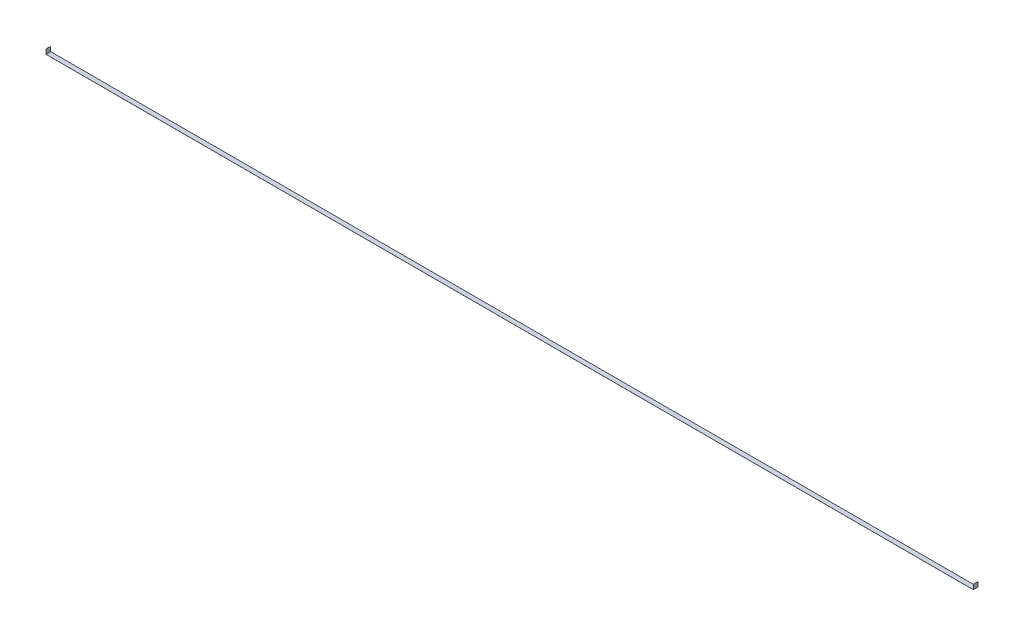
ISO-10303-21;
HEADER;
FILE_DESCRIPTION(('STEP AP214'),'2;1');
FILE_NAME('part.step','',(''),(''),'','','');
FILE_SCHEMA(('AUTOMOTIVE_DESIGN { 1 0 10303 214 1 1 1 1 }'));
ENDSEC;
DATA;
#1=APPLICATION_CONTEXT('core data for automotive mechanical design processes');
#2=APPLICATION_PROTOCOL_DEFINITION('international standard','automotive_design',2000,#1);
#3=PRODUCT_CONTEXT('',#1,'mechanical');
#4=PRODUCT('Part','Part','',(#3));
#5=PRODUCT_RELATED_PRODUCT_CATEGORY('part','',(#4));
#6=PRODUCT_DEFINITION_FORMATION('','',#4);
#7=PRODUCT_DEFINITION_CONTEXT('part definition',#1,'design');
#8=PRODUCT_DEFINITION('design','',#6,#7);
#9=PRODUCT_DEFINITION_SHAPE('','',#8);
#10=(LENGTH_UNIT() NAMED_UNIT(*) SI_UNIT(.MILLI.,.METRE.));
#11=(NAMED_UNIT(*) PLANE_ANGLE_UNIT() SI_UNIT($,.RADIAN.));
#12=(NAMED_UNIT(*) SI_UNIT($,.STERADIAN.) SOLID_ANGLE_UNIT());
#13=UNCERTAINTY_MEASURE_WITH_UNIT(LENGTH_MEASURE(1.E-05),#10,'distance_accuracy_value','');
#14=(GEOMETRIC_REPRESENTATION_CONTEXT(3) GLOBAL_UNCERTAINTY_ASSIGNED_CONTEXT((#13)) GLOBAL_UNIT_ASSIGNED_CONTEXT((#10,
#11,#12)) REPRESENTATION_CONTEXT('',''));
#15=CARTESIAN_POINT('',(0.,0.,0.));
#16=DIRECTION('',(0.,0.,1.));
#17=DIRECTION('',(1.,0.,0.));
#18=AXIS2_PLACEMENT_3D('',#15,#16,#17);
#19=CARTESIAN_POINT('',(-2527.3,0.,25.4));
#20=DIRECTION('',(-1.,0.,0.));
#21=DIRECTION('',(0.,0.,1.));
#22=AXIS2_PLACEMENT_3D('',#19,#20,#21);
#23=PLANE('',#22);
#24=DIRECTION('',(0.,1.,0.));
#25=VECTOR('',#24,1.);
#26=CARTESIAN_POINT('',(-2527.3,0.,0.));
#27=LINE('',#26,#25);
#28=CARTESIAN_POINT('',(-2527.3,0.,0.));
#29=VERTEX_POINT('',#28);
#30=CARTESIAN_POINT('',(-2527.3,25.4,0.));
#31=VERTEX_POINT('',#30);
#32=EDGE_CURVE('E136',#29,#31,#27,.T.);
#33=ORIENTED_EDGE('',*,*,#32,.T.);
#34=DIRECTION('',(0.,0.,-1.));
#35=VECTOR('',#34,1.);
#36=CARTESIAN_POINT('',(-2527.3,25.4,25.4));
#37=LINE('',#36,#35);
#38=CARTESIAN_POINT('',(-2527.3,25.4,25.4));
#39=VERTEX_POINT('',#38);
#40=EDGE_CURVE('E11',#39,#31,#37,.T.);
#41=ORIENTED_EDGE('',*,*,#40,.F.);
#42=DIRECTION('',(0.,1.,0.));
#43=VECTOR('',#42,1.);
#44=CARTESIAN_POINT('',(-2527.3,0.,25.4));
#45=LINE('',#44,#43);
#46=CARTESIAN_POINT('',(-2527.3,0.,25.4));
#47=VERTEX_POINT('',#46);
#48=EDGE_CURVE('E94',#47,#39,#45,.T.);
#49=ORIENTED_EDGE('',*,*,#48,.F.);
#50=DIRECTION('',(0.,0.,-1.));
#51=VECTOR('',#50,1.);
#52=CARTESIAN_POINT('',(-2527.3,0.,25.4));
#53=LINE('',#52,#51);
#54=EDGE_CURVE('E135',#47,#29,#53,.T.);
#55=ORIENTED_EDGE('',*,*,#54,.T.);
#56=EDGE_LOOP('',(#33,#41,#49,#55));
#57=FACE_BOUND('',#56,.T.);
#58=ADVANCED_FACE('F39',(#57),#23,.F.);
#59=CARTESIAN_POINT('',(-2527.554,25.4,25.4));
#60=DIRECTION('',(0.,1.,0.));
#61=DIRECTION('',(0.,0.,1.));
#62=AXIS2_PLACEMENT_3D('',#59,#60,#61);
#63=PLANE('',#62);
#64=DIRECTION('',(1.,0.,0.));
#65=VECTOR('',#64,1.);
#66=CARTESIAN_POINT('',(-2527.554,25.4,0.));
#67=LINE('',#66,#65);
#68=CARTESIAN_POINT('',(-2527.554,25.4,0.));
#69=VERTEX_POINT('',#68);
#70=EDGE_CURVE('E139',#69,#31,#67,.T.);
#71=ORIENTED_EDGE('',*,*,#70,.F.);
#72=DIRECTION('',(0.,0.,-1.));
#73=VECTOR('',#72,1.);
#74=CARTESIAN_POINT('',(-2527.554,25.4,25.4));
#75=LINE('',#74,#73);
#76=CARTESIAN_POINT('',(-2527.554,25.4,25.4));
#77=VERTEX_POINT('',#76);
#78=EDGE_CURVE('E47',#77,#69,#75,.T.);
#79=ORIENTED_EDGE('',*,*,#78,.F.);
#80=DIRECTION('',(1.,0.,0.));
#81=VECTOR('',#80,1.);
#82=CARTESIAN_POINT('',(-2527.554,25.4,25.4));
#83=LINE('',#82,#81);
#84=EDGE_CURVE('E178',#77,#39,#83,.T.);
#85=ORIENTED_EDGE('',*,*,#84,.T.);
#86=ORIENTED_EDGE('',*,*,#40,.T.);
#87=EDGE_LOOP('',(#71,#79,#85,#86));
#88=FACE_BOUND('',#87,.T.);
#89=ADVANCED_FACE('F169',(#88),#63,.T.);
#90=CARTESIAN_POINT('',(-2527.554,0.,25.4));
#91=DIRECTION('',(-1.,0.,0.));
#92=DIRECTION('',(0.,0.,1.));
#93=AXIS2_PLACEMENT_3D('',#90,#91,#92);
#94=PLANE('',#93);
#95=DIRECTION('',(0.,1.,0.));
#96=VECTOR('',#95,1.);
#97=CARTESIAN_POINT('',(-2527.554,0.,0.));
#98=LINE('',#97,#96);
#99=CARTESIAN_POINT('',(-2527.554,-0.254,0.));
#100=VERTEX_POINT('',#99);
#101=EDGE_CURVE('E142',#100,#69,#98,.T.);
#102=ORIENTED_EDGE('',*,*,#101,.F.);
#103=DIRECTION('',(0.,0.,-1.));
#104=VECTOR('',#103,1.);
#105=CARTESIAN_POINT('',(-2527.554,-0.254,25.4));
#106=LINE('',#105,#104);
#107=CARTESIAN_POINT('',(-2527.554,-0.254,25.4));
#108=VERTEX_POINT('',#107);
#109=EDGE_CURVE('E159',#108,#100,#106,.T.);
#110=ORIENTED_EDGE('',*,*,#109,.F.);
#111=DIRECTION('',(0.,1.,0.));
#112=VECTOR('',#111,1.);
#113=CARTESIAN_POINT('',(-2527.554,0.,25.4));
#114=LINE('',#113,#112);
#115=EDGE_CURVE('E166',#108,#77,#114,.T.);
#116=ORIENTED_EDGE('',*,*,#115,.T.);
#117=ORIENTED_EDGE('',*,*,#78,.T.);
#118=EDGE_LOOP('',(#102,#110,#116,#117));
#119=FACE_BOUND('',#118,.T.);
#120=ADVANCED_FACE('F164',(#119),#94,.T.);
#121=CARTESIAN_POINT('',(-2527.3,-0.254,25.4));
#122=DIRECTION('',(0.,-1.,0.));
#123=DIRECTION('',(1.,0.,0.));
#124=AXIS2_PLACEMENT_3D('',#121,#122,#123);
#125=PLANE('',#124);
#126=DIRECTION('',(-1.,0.,0.));
#127=VECTOR('',#126,1.);
#128=CARTESIAN_POINT('',(-2527.3,-0.254,0.));
#129=LINE('',#128,#127);
#130=CARTESIAN_POINT('',(2527.554,-0.253999999999071,0.));
#131=VERTEX_POINT('',#130);
#132=EDGE_CURVE('E145',#131,#100,#129,.T.);
#133=ORIENTED_EDGE('',*,*,#132,.F.);
#134=DIRECTION('',(0.,0.,-1.));
#135=VECTOR('',#134,1.);
#136=CARTESIAN_POINT('',(2527.554,-0.253999999999071,25.4));
#137=LINE('',#136,#135);
#138=CARTESIAN_POINT('',(2527.554,-0.253999999999071,25.4));
#139=VERTEX_POINT('',#138);
#140=EDGE_CURVE('E157',#139,#131,#137,.T.);
#141=ORIENTED_EDGE('',*,*,#140,.F.);
#142=DIRECTION('',(-1.,0.,0.));
#143=VECTOR('',#142,1.);
#144=CARTESIAN_POINT('',(-2527.3,-0.254,25.4));
#145=LINE('',#144,#143);
#146=EDGE_CURVE('E130',#139,#108,#145,.T.);
#147=ORIENTED_EDGE('',*,*,#146,.T.);
#148=ORIENTED_EDGE('',*,*,#109,.T.);
#149=EDGE_LOOP('',(#133,#141,#147,#148));
#150=FACE_BOUND('',#149,.T.);
#151=ADVANCED_FACE('F176',(#150),#125,.T.);
#152=CARTESIAN_POINT('',(2527.554,9.28514956645532E-13,25.4));
#153=DIRECTION('',(1.,0.,0.));
#154=DIRECTION('',(0.,0.,-1.));
#155=AXIS2_PLACEMENT_3D('',#152,#153,#154);
#156=PLANE('',#155);
#157=DIRECTION('',(0.,1.,0.));
#158=VECTOR('',#157,1.);
#159=CARTESIAN_POINT('',(2527.554,9.28514956645532E-13,0.));
#160=LINE('',#159,#158);
#161=CARTESIAN_POINT('',(2527.554,25.4000000000009,0.));
#162=VERTEX_POINT('',#161);
#163=EDGE_CURVE('E148',#162,#131,#160,.F.);
#164=ORIENTED_EDGE('',*,*,#163,.F.);
#165=DIRECTION('',(0.,0.,-1.));
#166=VECTOR('',#165,1.);
#167=CARTESIAN_POINT('',(2527.554,25.4000000000009,25.4));
#168=LINE('',#167,#166);
#169=CARTESIAN_POINT('',(2527.554,25.4000000000009,25.4));
#170=VERTEX_POINT('',#169);
#171=EDGE_CURVE('E118',#170,#162,#168,.T.);
#172=ORIENTED_EDGE('',*,*,#171,.F.);
#173=DIRECTION('',(0.,1.,0.));
#174=VECTOR('',#173,1.);
#175=CARTESIAN_POINT('',(2527.554,9.28514956645532E-13,25.4));
#176=LINE('',#175,#174);
#177=EDGE_CURVE('E128',#170,#139,#176,.F.);
#178=ORIENTED_EDGE('',*,*,#177,.T.);
#179=ORIENTED_EDGE('',*,*,#140,.T.);
#180=EDGE_LOOP('',(#164,#172,#178,#179));
#181=FACE_BOUND('',#180,.T.);
#182=ADVANCED_FACE('F183',(#181),#156,.T.);
#183=CARTESIAN_POINT('',(2527.3,25.4000000000009,25.4));
#184=DIRECTION('',(0.,1.,0.));
#185=DIRECTION('',(0.,0.,1.));
#186=AXIS2_PLACEMENT_3D('',#183,#184,#185);
#187=PLANE('',#186);
#188=DIRECTION('',(1.,0.,0.));
#189=VECTOR('',#188,1.);
#190=CARTESIAN_POINT('',(2527.3,25.4000000000009,0.));
#191=LINE('',#190,#189);
#192=CARTESIAN_POINT('',(2527.3,25.4000000000009,0.));
#193=VERTEX_POINT('',#192);
#194=EDGE_CURVE('E117',#193,#162,#191,.T.);
#195=ORIENTED_EDGE('',*,*,#194,.F.);
#196=DIRECTION('',(0.,0.,-1.));
#197=VECTOR('',#196,1.);
#198=CARTESIAN_POINT('',(2527.3,25.4000000000009,25.4));
#199=LINE('',#198,#197);
#200=CARTESIAN_POINT('',(2527.3,25.4000000000009,25.4));
#201=VERTEX_POINT('',#200);
#202=EDGE_CURVE('E111',#201,#193,#199,.T.);
#203=ORIENTED_EDGE('',*,*,#202,.F.);
#204=DIRECTION('',(1.,0.,0.));
#205=VECTOR('',#204,1.);
#206=CARTESIAN_POINT('',(2527.3,25.4000000000009,25.4));
#207=LINE('',#206,#205);
#208=EDGE_CURVE('E115',#201,#170,#207,.T.);
#209=ORIENTED_EDGE('',*,*,#208,.T.);
#210=ORIENTED_EDGE('',*,*,#171,.T.);
#211=EDGE_LOOP('',(#195,#203,#209,#210));
#212=FACE_BOUND('',#211,.T.);
#213=ADVANCED_FACE('F113',(#212),#187,.T.);
#214=CARTESIAN_POINT('',(2527.3,9.28514956645532E-13,25.4));
#215=DIRECTION('',(1.,0.,0.));
#216=DIRECTION('',(0.,0.,-1.));
#217=AXIS2_PLACEMENT_3D('',#214,#215,#216);
#218=PLANE('',#217);
#219=DIRECTION('',(0.,-1.,0.));
#220=VECTOR('',#219,1.);
#221=CARTESIAN_POINT('',(2527.3,9.28514956645532E-13,0.));
#222=LINE('',#221,#220);
#223=CARTESIAN_POINT('',(2527.3,9.28514956645532E-13,0.));
#224=VERTEX_POINT('',#223);
#225=EDGE_CURVE('E82',#193,#224,#222,.T.);
#226=ORIENTED_EDGE('',*,*,#225,.T.);
#227=DIRECTION('',(0.,0.,-1.));
#228=VECTOR('',#227,1.);
#229=CARTESIAN_POINT('',(2527.3,9.28514956645532E-13,25.4));
#230=LINE('',#229,#228);
#231=CARTESIAN_POINT('',(2527.3,9.28514956645532E-13,25.4));
#232=VERTEX_POINT('',#231);
#233=EDGE_CURVE('E119',#232,#224,#230,.T.);
#234=ORIENTED_EDGE('',*,*,#233,.F.);
#235=DIRECTION('',(0.,-1.,0.));
#236=VECTOR('',#235,1.);
#237=CARTESIAN_POINT('',(2527.3,9.28514956645532E-13,25.4));
#238=LINE('',#237,#236);
#239=EDGE_CURVE('E121',#201,#232,#238,.T.);
#240=ORIENTED_EDGE('',*,*,#239,.F.);
#241=ORIENTED_EDGE('',*,*,#202,.T.);
#242=EDGE_LOOP('',(#226,#234,#240,#241));
#243=FACE_BOUND('',#242,.T.);
#244=ADVANCED_FACE('F122',(#243),#218,.F.);
#245=CARTESIAN_POINT('',(-2527.3,0.,25.4));
#246=DIRECTION('',(0.,-1.,0.));
#247=DIRECTION('',(1.,0.,0.));
#248=AXIS2_PLACEMENT_3D('',#245,#246,#247);
#249=PLANE('',#248);
#250=DIRECTION('',(-1.,0.,0.));
#251=VECTOR('',#250,1.);
#252=CARTESIAN_POINT('',(-2527.3,0.,0.));
#253=LINE('',#252,#251);
#254=EDGE_CURVE('E88',#224,#29,#253,.T.);
#255=ORIENTED_EDGE('',*,*,#254,.T.);
#256=ORIENTED_EDGE('',*,*,#54,.F.);
#257=DIRECTION('',(-1.,0.,0.));
#258=VECTOR('',#257,1.);
#259=CARTESIAN_POINT('',(-2527.3,0.,25.4));
#260=LINE('',#259,#258);
#261=EDGE_CURVE('E55',#232,#47,#260,.T.);
#262=ORIENTED_EDGE('',*,*,#261,.F.);
#263=ORIENTED_EDGE('',*,*,#233,.T.);
#264=EDGE_LOOP('',(#255,#256,#262,#263));
#265=FACE_BOUND('',#264,.T.);
#266=ADVANCED_FACE('F185',(#265),#249,.F.);
#267=CARTESIAN_POINT('',(0.,0.,25.4));
#268=DIRECTION('',(0.,0.,-1.));
#269=DIRECTION('',(-1.,0.,0.));
#270=AXIS2_PLACEMENT_3D('',#267,#268,#269);
#271=PLANE('',#270);
#272=ORIENTED_EDGE('',*,*,#48,.T.);
#273=ORIENTED_EDGE('',*,*,#84,.F.);
#274=ORIENTED_EDGE('',*,*,#115,.F.);
#275=ORIENTED_EDGE('',*,*,#146,.F.);
#276=ORIENTED_EDGE('',*,*,#177,.F.);
#277=ORIENTED_EDGE('',*,*,#208,.F.);
#278=ORIENTED_EDGE('',*,*,#239,.T.);
#279=ORIENTED_EDGE('',*,*,#261,.T.);
#280=EDGE_LOOP('',(#272,#273,#274,#275,#276,#277,#278,#279));
#281=FACE_BOUND('',#280,.T.);
#282=ADVANCED_FACE('F125',(#281),#271,.F.);
#283=CARTESIAN_POINT('',(0.,0.,0.));
#284=DIRECTION('',(0.,0.,-1.));
#285=DIRECTION('',(-1.,0.,0.));
#286=AXIS2_PLACEMENT_3D('',#283,#284,#285);
#287=PLANE('',#286);
#288=ORIENTED_EDGE('',*,*,#32,.F.);
#289=ORIENTED_EDGE('',*,*,#254,.F.);
#290=ORIENTED_EDGE('',*,*,#225,.F.);
#291=ORIENTED_EDGE('',*,*,#194,.T.);
#292=ORIENTED_EDGE('',*,*,#163,.T.);
#293=ORIENTED_EDGE('',*,*,#132,.T.);
#294=ORIENTED_EDGE('',*,*,#101,.T.);
#295=ORIENTED_EDGE('',*,*,#70,.T.);
#296=EDGE_LOOP('',(#288,#289,#290,#291,#292,#293,#294,#295));
#297=FACE_BOUND('',#296,.T.);
#298=ADVANCED_FACE('F172',(#297),#287,.T.);
#299=CLOSED_SHELL('',(#58,#89,#120,#151,#182,#213,#244,#266,#282,#298));
#300=MANIFOLD_SOLID_BREP('B2',#299);
#301=ADVANCED_BREP_SHAPE_REPRESENTATION('',(#18,#300),#14);
#302=SHAPE_DEFINITION_REPRESENTATION(#9,#301);
ENDSEC;
END-ISO-10303-21;
